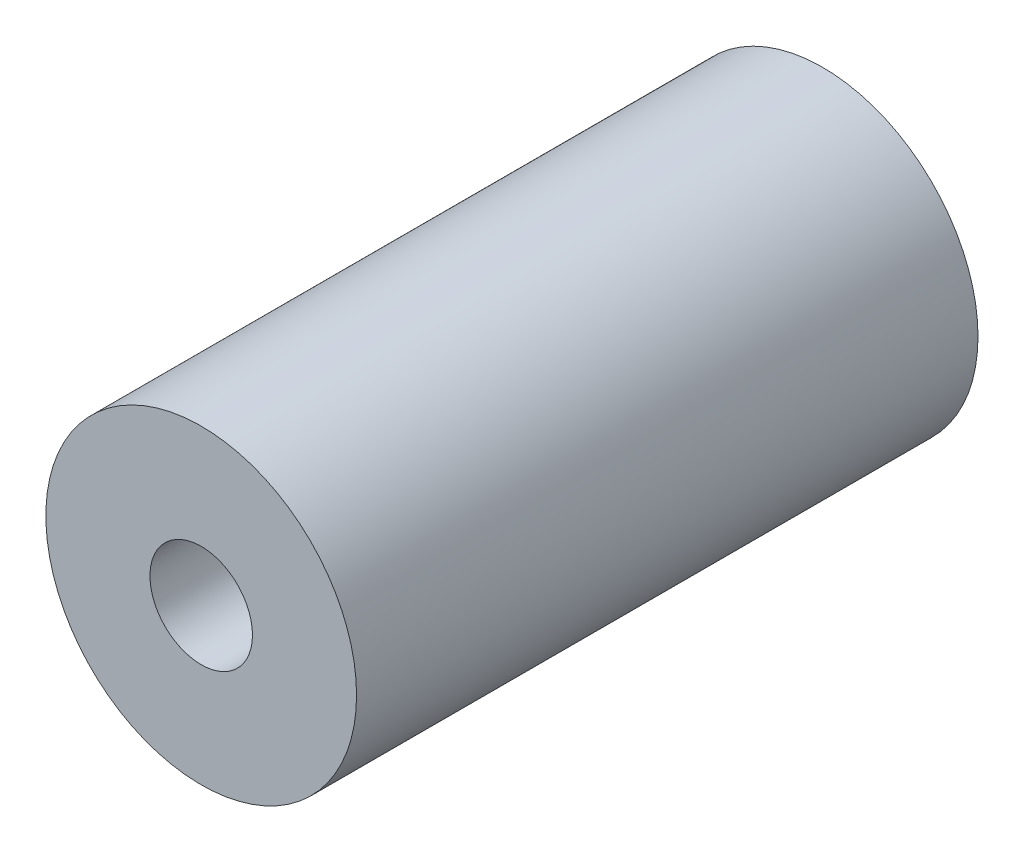
ISO-10303-21;
HEADER;
FILE_DESCRIPTION(('STEP AP214'),'2;1');
FILE_NAME('part.step','',(''),(''),'','','');
FILE_SCHEMA(('AUTOMOTIVE_DESIGN { 1 0 10303 214 1 1 1 1 }'));
ENDSEC;
DATA;
#1=APPLICATION_CONTEXT('core data for automotive mechanical design processes');
#2=APPLICATION_PROTOCOL_DEFINITION('international standard','automotive_design',2000,#1);
#3=PRODUCT_CONTEXT('',#1,'mechanical');
#4=PRODUCT('Part','Part','',(#3));
#5=PRODUCT_RELATED_PRODUCT_CATEGORY('part','',(#4));
#6=PRODUCT_DEFINITION_FORMATION('','',#4);
#7=PRODUCT_DEFINITION_CONTEXT('part definition',#1,'design');
#8=PRODUCT_DEFINITION('design','',#6,#7);
#9=PRODUCT_DEFINITION_SHAPE('','',#8);
#10=(LENGTH_UNIT() NAMED_UNIT(*) SI_UNIT(.MILLI.,.METRE.));
#11=(NAMED_UNIT(*) PLANE_ANGLE_UNIT() SI_UNIT($,.RADIAN.));
#12=(NAMED_UNIT(*) SI_UNIT($,.STERADIAN.) SOLID_ANGLE_UNIT());
#13=UNCERTAINTY_MEASURE_WITH_UNIT(LENGTH_MEASURE(1.E-05),#10,'distance_accuracy_value','');
#14=(GEOMETRIC_REPRESENTATION_CONTEXT(3) GLOBAL_UNCERTAINTY_ASSIGNED_CONTEXT((#13)) GLOBAL_UNIT_ASSIGNED_CONTEXT((#10,
#11,#12)) REPRESENTATION_CONTEXT('',''));
#15=CARTESIAN_POINT('',(0.,0.,0.));
#16=DIRECTION('',(0.,0.,1.));
#17=DIRECTION('',(1.,0.,0.));
#18=AXIS2_PLACEMENT_3D('',#15,#16,#17);
#19=CARTESIAN_POINT('',(0.,0.,200.));
#20=DIRECTION('',(0.,0.,1.));
#21=DIRECTION('',(1.,0.,0.));
#22=AXIS2_PLACEMENT_3D('',#19,#20,#21);
#23=PLANE('',#22);
#24=CARTESIAN_POINT('',(0.,0.,200.));
#25=DIRECTION('',(0.,0.,1.));
#26=DIRECTION('',(1.,0.,0.));
#27=AXIS2_PLACEMENT_3D('',#24,#25,#26);
#28=CIRCLE('',#27,50.);
#29=CARTESIAN_POINT('',(50.,0.,200.));
#30=VERTEX_POINT('',#29);
#31=EDGE_CURVE('E10',#30,#30,#28,.T.);
#32=ORIENTED_EDGE('',*,*,#31,.T.);
#33=EDGE_LOOP('',(#32));
#34=FACE_BOUND('',#33,.T.);
#35=CARTESIAN_POINT('',(0.,0.,200.));
#36=DIRECTION('',(0.,0.,1.));
#37=DIRECTION('',(1.,0.,0.));
#38=AXIS2_PLACEMENT_3D('',#35,#36,#37);
#39=CIRCLE('',#38,16.5);
#40=CARTESIAN_POINT('',(16.5,0.,200.));
#41=VERTEX_POINT('',#40);
#42=EDGE_CURVE('E50',#41,#41,#39,.T.);
#43=ORIENTED_EDGE('',*,*,#42,.F.);
#44=EDGE_LOOP('',(#43));
#45=FACE_BOUND('',#44,.T.);
#46=ADVANCED_FACE('F37',(#34,#45),#23,.T.);
#47=CARTESIAN_POINT('',(0.,0.,0.));
#48=DIRECTION('',(0.,0.,1.));
#49=DIRECTION('',(1.,0.,0.));
#50=AXIS2_PLACEMENT_3D('',#47,#48,#49);
#51=PLANE('',#50);
#52=CARTESIAN_POINT('',(0.,0.,0.));
#53=DIRECTION('',(0.,0.,1.));
#54=DIRECTION('',(1.,0.,0.));
#55=AXIS2_PLACEMENT_3D('',#52,#53,#54);
#56=CIRCLE('',#55,50.);
#57=CARTESIAN_POINT('',(50.,0.,0.));
#58=VERTEX_POINT('',#57);
#59=EDGE_CURVE('E41',#58,#58,#56,.T.);
#60=ORIENTED_EDGE('',*,*,#59,.F.);
#61=EDGE_LOOP('',(#60));
#62=FACE_BOUND('',#61,.T.);
#63=CARTESIAN_POINT('',(0.,0.,0.));
#64=DIRECTION('',(0.,0.,1.));
#65=DIRECTION('',(1.,0.,0.));
#66=AXIS2_PLACEMENT_3D('',#63,#64,#65);
#67=CIRCLE('',#66,16.5);
#68=CARTESIAN_POINT('',(16.5,0.,0.));
#69=VERTEX_POINT('',#68);
#70=EDGE_CURVE('E52',#69,#69,#67,.T.);
#71=ORIENTED_EDGE('',*,*,#70,.T.);
#72=EDGE_LOOP('',(#71));
#73=FACE_BOUND('',#72,.T.);
#74=ADVANCED_FACE('F64',(#62,#73),#51,.F.);
#75=CARTESIAN_POINT('',(0.,0.,200.));
#76=DIRECTION('',(0.,0.,-1.));
#77=DIRECTION('',(-1.,0.,0.));
#78=AXIS2_PLACEMENT_3D('',#75,#76,#77);
#79=CYLINDRICAL_SURFACE('',#78,50.);
#80=ORIENTED_EDGE('',*,*,#31,.F.);
#81=EDGE_LOOP('',(#80));
#82=FACE_BOUND('',#81,.T.);
#83=ORIENTED_EDGE('',*,*,#59,.T.);
#84=EDGE_LOOP('',(#83));
#85=FACE_BOUND('',#84,.T.);
#86=ADVANCED_FACE('F39',(#82,#85),#79,.T.);
#87=CARTESIAN_POINT('',(0.,0.,200.));
#88=DIRECTION('',(0.,0.,-1.));
#89=DIRECTION('',(-1.,0.,0.));
#90=AXIS2_PLACEMENT_3D('',#87,#88,#89);
#91=CYLINDRICAL_SURFACE('',#90,16.5);
#92=ORIENTED_EDGE('',*,*,#42,.T.);
#93=EDGE_LOOP('',(#92));
#94=FACE_BOUND('',#93,.T.);
#95=ORIENTED_EDGE('',*,*,#70,.F.);
#96=EDGE_LOOP('',(#95));
#97=FACE_BOUND('',#96,.T.);
#98=ADVANCED_FACE('F60',(#94,#97),#91,.F.);
#99=CLOSED_SHELL('',(#46,#74,#86,#98));
#100=MANIFOLD_SOLID_BREP('B2',#99);
#101=ADVANCED_BREP_SHAPE_REPRESENTATION('',(#18,#100),#14);
#102=SHAPE_DEFINITION_REPRESENTATION(#9,#101);
ENDSEC;
END-ISO-10303-21;
